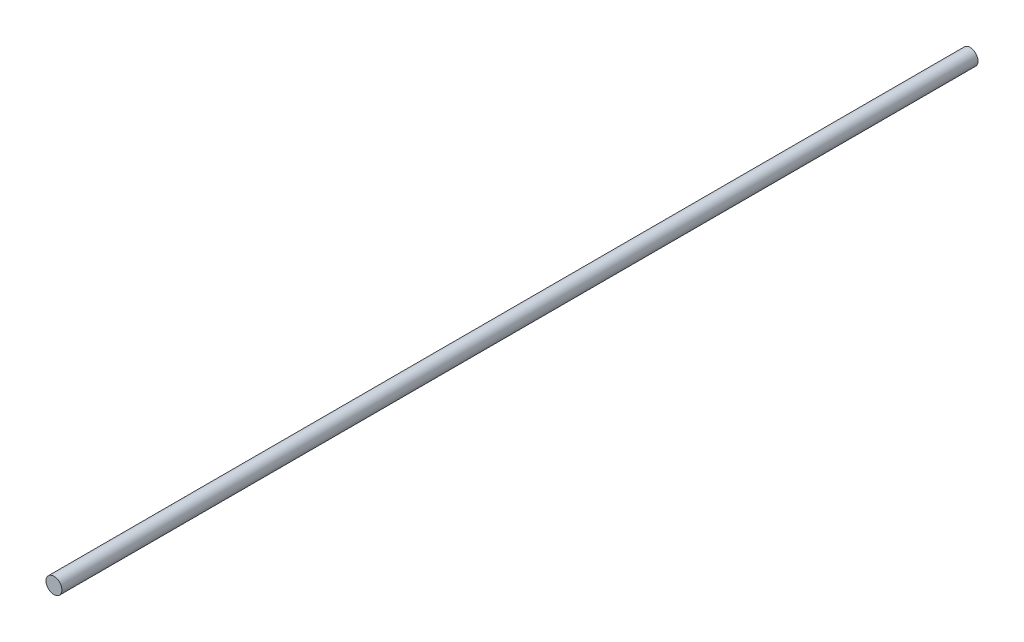
ISO-10303-21;
HEADER;
FILE_DESCRIPTION(('STEP AP214'),'2;1');
FILE_NAME('part.step','',(''),(''),'','','');
FILE_SCHEMA(('AUTOMOTIVE_DESIGN { 1 0 10303 214 1 1 1 1 }'));
ENDSEC;
DATA;
#1=APPLICATION_CONTEXT('core data for automotive mechanical design processes');
#2=APPLICATION_PROTOCOL_DEFINITION('international standard','automotive_design',2000,#1);
#3=PRODUCT_CONTEXT('',#1,'mechanical');
#4=PRODUCT('Part','Part','',(#3));
#5=PRODUCT_RELATED_PRODUCT_CATEGORY('part','',(#4));
#6=PRODUCT_DEFINITION_FORMATION('','',#4);
#7=PRODUCT_DEFINITION_CONTEXT('part definition',#1,'design');
#8=PRODUCT_DEFINITION('design','',#6,#7);
#9=PRODUCT_DEFINITION_SHAPE('','',#8);
#10=(LENGTH_UNIT() NAMED_UNIT(*) SI_UNIT(.MILLI.,.METRE.));
#11=(NAMED_UNIT(*) PLANE_ANGLE_UNIT() SI_UNIT($,.RADIAN.));
#12=(NAMED_UNIT(*) SI_UNIT($,.STERADIAN.) SOLID_ANGLE_UNIT());
#13=UNCERTAINTY_MEASURE_WITH_UNIT(LENGTH_MEASURE(1.E-05),#10,'distance_accuracy_value','');
#14=(GEOMETRIC_REPRESENTATION_CONTEXT(3) GLOBAL_UNCERTAINTY_ASSIGNED_CONTEXT((#13)) GLOBAL_UNIT_ASSIGNED_CONTEXT((#10,
#11,#12)) REPRESENTATION_CONTEXT('',''));
#15=CARTESIAN_POINT('',(0.,0.,0.));
#16=DIRECTION('',(0.,0.,1.));
#17=DIRECTION('',(1.,0.,0.));
#18=AXIS2_PLACEMENT_3D('',#15,#16,#17);
#19=CARTESIAN_POINT('',(0.,0.,461.));
#20=DIRECTION('',(0.,0.,-1.));
#21=DIRECTION('',(-1.,0.,0.));
#22=AXIS2_PLACEMENT_3D('',#19,#20,#21);
#23=CYLINDRICAL_SURFACE('',#22,4.);
#24=CARTESIAN_POINT('',(0.,0.,461.));
#25=DIRECTION('',(0.,0.,1.));
#26=DIRECTION('',(1.,0.,0.));
#27=AXIS2_PLACEMENT_3D('',#24,#25,#26);
#28=CIRCLE('',#27,4.);
#29=CARTESIAN_POINT('',(4.,0.,461.));
#30=VERTEX_POINT('',#29);
#31=EDGE_CURVE('E10',#30,#30,#28,.T.);
#32=ORIENTED_EDGE('',*,*,#31,.F.);
#33=EDGE_LOOP('',(#32));
#34=FACE_BOUND('',#33,.T.);
#35=CARTESIAN_POINT('',(0.,0.,0.));
#36=DIRECTION('',(0.,0.,1.));
#37=DIRECTION('',(1.,0.,0.));
#38=AXIS2_PLACEMENT_3D('',#35,#36,#37);
#39=CIRCLE('',#38,4.);
#40=CARTESIAN_POINT('',(4.,0.,0.));
#41=VERTEX_POINT('',#40);
#42=EDGE_CURVE('E34',#41,#41,#39,.T.);
#43=ORIENTED_EDGE('',*,*,#42,.T.);
#44=EDGE_LOOP('',(#43));
#45=FACE_BOUND('',#44,.T.);
#46=ADVANCED_FACE('F31',(#34,#45),#23,.T.);
#47=CARTESIAN_POINT('',(0.,0.,461.));
#48=DIRECTION('',(0.,0.,1.));
#49=DIRECTION('',(1.,0.,0.));
#50=AXIS2_PLACEMENT_3D('',#47,#48,#49);
#51=PLANE('',#50);
#52=ORIENTED_EDGE('',*,*,#31,.T.);
#53=EDGE_LOOP('',(#52));
#54=FACE_BOUND('',#53,.T.);
#55=ADVANCED_FACE('F46',(#54),#51,.T.);
#56=CARTESIAN_POINT('',(0.,0.,0.));
#57=DIRECTION('',(0.,0.,1.));
#58=DIRECTION('',(1.,0.,0.));
#59=AXIS2_PLACEMENT_3D('',#56,#57,#58);
#60=PLANE('',#59);
#61=ORIENTED_EDGE('',*,*,#42,.F.);
#62=EDGE_LOOP('',(#61));
#63=FACE_BOUND('',#62,.T.);
#64=ADVANCED_FACE('F44',(#63),#60,.F.);
#65=CLOSED_SHELL('',(#46,#55,#64));
#66=MANIFOLD_SOLID_BREP('B2',#65);
#67=ADVANCED_BREP_SHAPE_REPRESENTATION('',(#18,#66),#14);
#68=SHAPE_DEFINITION_REPRESENTATION(#9,#67);
ENDSEC;
END-ISO-10303-21;
